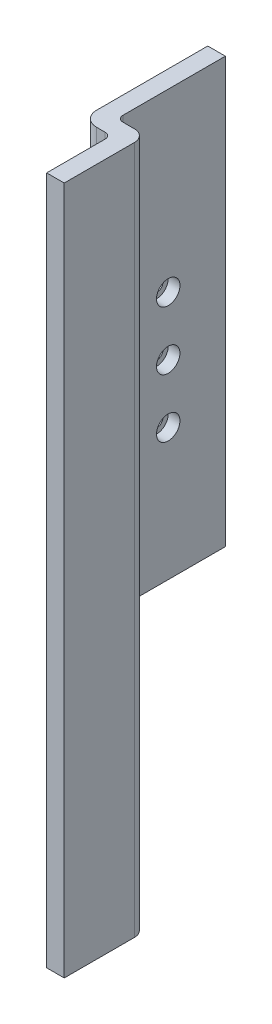
ISO-10303-21;
HEADER;
FILE_DESCRIPTION(('STEP AP214'),'2;1');
FILE_NAME('part.step','',(''),(''),'','','');
FILE_SCHEMA(('AUTOMOTIVE_DESIGN { 1 0 10303 214 1 1 1 1 }'));
ENDSEC;
DATA;
#1=APPLICATION_CONTEXT('core data for automotive mechanical design processes');
#2=APPLICATION_PROTOCOL_DEFINITION('international standard','automotive_design',2000,#1);
#3=PRODUCT_CONTEXT('',#1,'mechanical');
#4=PRODUCT('Part','Part','',(#3));
#5=PRODUCT_RELATED_PRODUCT_CATEGORY('part','',(#4));
#6=PRODUCT_DEFINITION_FORMATION('','',#4);
#7=PRODUCT_DEFINITION_CONTEXT('part definition',#1,'design');
#8=PRODUCT_DEFINITION('design','',#6,#7);
#9=PRODUCT_DEFINITION_SHAPE('','',#8);
#10=(LENGTH_UNIT() NAMED_UNIT(*) SI_UNIT(.MILLI.,.METRE.));
#11=(NAMED_UNIT(*) PLANE_ANGLE_UNIT() SI_UNIT($,.RADIAN.));
#12=(NAMED_UNIT(*) SI_UNIT($,.STERADIAN.) SOLID_ANGLE_UNIT());
#13=UNCERTAINTY_MEASURE_WITH_UNIT(LENGTH_MEASURE(1.E-05),#10,'distance_accuracy_value','');
#14=(GEOMETRIC_REPRESENTATION_CONTEXT(3) GLOBAL_UNCERTAINTY_ASSIGNED_CONTEXT((#13)) GLOBAL_UNIT_ASSIGNED_CONTEXT((#10,
#11,#12)) REPRESENTATION_CONTEXT('',''));
#15=CARTESIAN_POINT('',(0.,0.,0.));
#16=DIRECTION('',(0.,0.,1.));
#17=DIRECTION('',(1.,0.,0.));
#18=AXIS2_PLACEMENT_3D('',#15,#16,#17);
#19=CARTESIAN_POINT('',(16.,235.,-43.));
#20=DIRECTION('',(0.,0.,-1.));
#21=DIRECTION('',(-1.,0.,0.));
#22=AXIS2_PLACEMENT_3D('',#19,#20,#21);
#23=PLANE('',#22);
#24=DIRECTION('',(-1.,0.,0.));
#25=VECTOR('',#24,1.);
#26=CARTESIAN_POINT('',(16.,90.,-43.));
#27=LINE('',#26,#25);
#28=CARTESIAN_POINT('',(6.,90.,-43.));
#29=VERTEX_POINT('',#28);
#30=CARTESIAN_POINT('',(0.,90.,-43.));
#31=VERTEX_POINT('',#30);
#32=EDGE_CURVE('E241',#29,#31,#27,.T.);
#33=ORIENTED_EDGE('',*,*,#32,.T.);
#34=DIRECTION('',(0.,-1.,0.));
#35=VECTOR('',#34,1.);
#36=CARTESIAN_POINT('',(0.,235.,-43.));
#37=LINE('',#36,#35);
#38=CARTESIAN_POINT('',(0.,235.,-43.));
#39=VERTEX_POINT('',#38);
#40=EDGE_CURVE('E252',#39,#31,#37,.T.);
#41=ORIENTED_EDGE('',*,*,#40,.F.);
#42=DIRECTION('',(-1.,0.,0.));
#43=VECTOR('',#42,1.);
#44=CARTESIAN_POINT('',(16.,235.,-43.));
#45=LINE('',#44,#43);
#46=CARTESIAN_POINT('',(6.,235.,-43.));
#47=VERTEX_POINT('',#46);
#48=EDGE_CURVE('E168',#47,#39,#45,.T.);
#49=ORIENTED_EDGE('',*,*,#48,.F.);
#50=DIRECTION('',(0.,-1.,0.));
#51=VECTOR('',#50,1.);
#52=CARTESIAN_POINT('',(6.,235.,-43.));
#53=LINE('',#52,#51);
#54=EDGE_CURVE('E251',#47,#29,#53,.T.);
#55=ORIENTED_EDGE('',*,*,#54,.T.);
#56=EDGE_LOOP('',(#33,#41,#49,#55));
#57=FACE_BOUND('',#56,.T.);
#58=ADVANCED_FACE('F36',(#57),#23,.T.);
#59=CARTESIAN_POINT('',(16.,235.,22.));
#60=DIRECTION('',(0.,1.,0.));
#61=DIRECTION('',(0.,0.,1.));
#62=AXIS2_PLACEMENT_3D('',#59,#60,#61);
#63=PLANE('',#62);
#64=DIRECTION('',(0.,0.,-1.));
#65=VECTOR('',#64,1.);
#66=CARTESIAN_POINT('',(0.,235.,22.));
#67=LINE('',#66,#65);
#68=CARTESIAN_POINT('',(0.,235.,-5.));
#69=VERTEX_POINT('',#68);
#70=EDGE_CURVE('E263',#69,#39,#67,.T.);
#71=ORIENTED_EDGE('',*,*,#70,.F.);
#72=CARTESIAN_POINT('',(5.,235.,-5.));
#73=DIRECTION('',(0.,1.,0.));
#74=DIRECTION('',(0.,0.,1.));
#75=AXIS2_PLACEMENT_3D('',#72,#73,#74);
#76=CIRCLE('',#75,5.);
#77=CARTESIAN_POINT('',(5.,235.,0.));
#78=VERTEX_POINT('',#77);
#79=EDGE_CURVE('E216',#69,#78,#76,.T.);
#80=ORIENTED_EDGE('',*,*,#79,.T.);
#81=DIRECTION('',(1.,0.,0.));
#82=VECTOR('',#81,1.);
#83=CARTESIAN_POINT('',(0.,235.,0.));
#84=LINE('',#83,#82);
#85=CARTESIAN_POINT('',(8.,235.,0.));
#86=VERTEX_POINT('',#85);
#87=EDGE_CURVE('E153',#78,#86,#84,.T.);
#88=ORIENTED_EDGE('',*,*,#87,.T.);
#89=CARTESIAN_POINT('',(8.,235.,2.));
#90=DIRECTION('',(0.,1.,0.));
#91=DIRECTION('',(0.,0.,1.));
#92=AXIS2_PLACEMENT_3D('',#89,#90,#91);
#93=CIRCLE('',#92,2.);
#94=CARTESIAN_POINT('',(10.,235.,2.));
#95=VERTEX_POINT('',#94);
#96=EDGE_CURVE('E148',#86,#95,#93,.F.);
#97=ORIENTED_EDGE('',*,*,#96,.T.);
#98=DIRECTION('',(0.,0.,1.));
#99=VECTOR('',#98,1.);
#100=CARTESIAN_POINT('',(10.,235.,0.));
#101=LINE('',#100,#99);
#102=CARTESIAN_POINT('',(10.,235.,22.));
#103=VERTEX_POINT('',#102);
#104=EDGE_CURVE('E139',#95,#103,#101,.T.);
#105=ORIENTED_EDGE('',*,*,#104,.T.);
#106=DIRECTION('',(-1.,0.,0.));
#107=VECTOR('',#106,1.);
#108=CARTESIAN_POINT('',(16.,235.,22.));
#109=LINE('',#108,#107);
#110=CARTESIAN_POINT('',(16.,235.,22.));
#111=VERTEX_POINT('',#110);
#112=EDGE_CURVE('E145',#111,#103,#109,.T.);
#113=ORIENTED_EDGE('',*,*,#112,.F.);
#114=DIRECTION('',(0.,0.,-1.));
#115=VECTOR('',#114,1.);
#116=CARTESIAN_POINT('',(16.,235.,22.));
#117=LINE('',#116,#115);
#118=CARTESIAN_POINT('',(16.,235.,-2.));
#119=VERTEX_POINT('',#118);
#120=EDGE_CURVE('E174',#111,#119,#117,.T.);
#121=ORIENTED_EDGE('',*,*,#120,.T.);
#122=CARTESIAN_POINT('',(12.,235.,-2.));
#123=DIRECTION('',(0.,1.,0.));
#124=DIRECTION('',(0.,0.,1.));
#125=AXIS2_PLACEMENT_3D('',#122,#123,#124);
#126=CIRCLE('',#125,4.);
#127=CARTESIAN_POINT('',(12.,235.,-6.));
#128=VERTEX_POINT('',#127);
#129=EDGE_CURVE('E207',#119,#128,#126,.T.);
#130=ORIENTED_EDGE('',*,*,#129,.T.);
#131=DIRECTION('',(-1.,0.,0.));
#132=VECTOR('',#131,1.);
#133=CARTESIAN_POINT('',(16.,235.,-6.));
#134=LINE('',#133,#132);
#135=CARTESIAN_POINT('',(8.,235.,-6.));
#136=VERTEX_POINT('',#135);
#137=EDGE_CURVE('E257',#128,#136,#134,.T.);
#138=ORIENTED_EDGE('',*,*,#137,.T.);
#139=CARTESIAN_POINT('',(8.,235.,-8.));
#140=DIRECTION('',(0.,1.,0.));
#141=DIRECTION('',(0.,0.,1.));
#142=AXIS2_PLACEMENT_3D('',#139,#140,#141);
#143=CIRCLE('',#142,2.);
#144=CARTESIAN_POINT('',(6.,235.,-8.));
#145=VERTEX_POINT('',#144);
#146=EDGE_CURVE('E198',#136,#145,#143,.F.);
#147=ORIENTED_EDGE('',*,*,#146,.T.);
#148=DIRECTION('',(0.,0.,-1.));
#149=VECTOR('',#148,1.);
#150=CARTESIAN_POINT('',(6.,235.,-6.00000000000001));
#151=LINE('',#150,#149);
#152=EDGE_CURVE('E253',#145,#47,#151,.T.);
#153=ORIENTED_EDGE('',*,*,#152,.T.);
#154=ORIENTED_EDGE('',*,*,#48,.T.);
#155=EDGE_LOOP('',(#71,#80,#88,#97,#105,#113,#121,#130,#138,#147,#153,#154));
#156=FACE_BOUND('',#155,.T.);
#157=ADVANCED_FACE('F142',(#156),#63,.T.);
#158=CARTESIAN_POINT('',(16.,0.,22.));
#159=DIRECTION('',(0.,0.,1.));
#160=DIRECTION('',(1.,0.,0.));
#161=AXIS2_PLACEMENT_3D('',#158,#159,#160);
#162=PLANE('',#161);
#163=DIRECTION('',(0.,-1.,0.));
#164=VECTOR('',#163,1.);
#165=CARTESIAN_POINT('',(10.,235.,22.));
#166=LINE('',#165,#164);
#167=CARTESIAN_POINT('',(10.,0.,22.));
#168=VERTEX_POINT('',#167);
#169=EDGE_CURVE('E152',#103,#168,#166,.T.);
#170=ORIENTED_EDGE('',*,*,#169,.T.);
#171=DIRECTION('',(-1.,0.,0.));
#172=VECTOR('',#171,1.);
#173=CARTESIAN_POINT('',(16.,0.,22.));
#174=LINE('',#173,#172);
#175=CARTESIAN_POINT('',(16.,0.,22.));
#176=VERTEX_POINT('',#175);
#177=EDGE_CURVE('E169',#176,#168,#174,.T.);
#178=ORIENTED_EDGE('',*,*,#177,.F.);
#179=DIRECTION('',(0.,1.,0.));
#180=VECTOR('',#179,1.);
#181=CARTESIAN_POINT('',(16.,0.,22.));
#182=LINE('',#181,#180);
#183=EDGE_CURVE('E166',#176,#111,#182,.T.);
#184=ORIENTED_EDGE('',*,*,#183,.T.);
#185=ORIENTED_EDGE('',*,*,#112,.T.);
#186=EDGE_LOOP('',(#170,#178,#184,#185));
#187=FACE_BOUND('',#186,.T.);
#188=ADVANCED_FACE('F164',(#187),#162,.T.);
#189=CARTESIAN_POINT('',(16.,0.,-43.));
#190=DIRECTION('',(0.,-1.,0.));
#191=DIRECTION('',(0.,0.,-1.));
#192=AXIS2_PLACEMENT_3D('',#189,#190,#191);
#193=PLANE('',#192);
#194=DIRECTION('',(1.,0.,0.));
#195=VECTOR('',#194,1.);
#196=CARTESIAN_POINT('',(0.,0.,0.));
#197=LINE('',#196,#195);
#198=CARTESIAN_POINT('',(5.,0.,0.));
#199=VERTEX_POINT('',#198);
#200=CARTESIAN_POINT('',(8.,0.,0.));
#201=VERTEX_POINT('',#200);
#202=EDGE_CURVE('E285',#199,#201,#197,.T.);
#203=ORIENTED_EDGE('',*,*,#202,.F.);
#204=CARTESIAN_POINT('',(5.,0.,-5.));
#205=DIRECTION('',(0.,-1.,0.));
#206=DIRECTION('',(0.,0.,-1.));
#207=AXIS2_PLACEMENT_3D('',#204,#205,#206);
#208=CIRCLE('',#207,5.);
#209=CARTESIAN_POINT('',(0.,0.,-5.));
#210=VERTEX_POINT('',#209);
#211=EDGE_CURVE('E212',#199,#210,#208,.T.);
#212=ORIENTED_EDGE('',*,*,#211,.T.);
#213=DIRECTION('',(0.,0.,1.));
#214=VECTOR('',#213,1.);
#215=CARTESIAN_POINT('',(0.,0.,-43.));
#216=LINE('',#215,#214);
#217=CARTESIAN_POINT('',(0.,0.,-8.));
#218=VERTEX_POINT('',#217);
#219=EDGE_CURVE('E255',#218,#210,#216,.T.);
#220=ORIENTED_EDGE('',*,*,#219,.F.);
#221=DIRECTION('',(-1.,0.,0.));
#222=VECTOR('',#221,1.);
#223=CARTESIAN_POINT('',(16.,0.,-8.));
#224=LINE('',#223,#222);
#225=CARTESIAN_POINT('',(6.,0.,-8.));
#226=VERTEX_POINT('',#225);
#227=EDGE_CURVE('E248',#226,#218,#224,.T.);
#228=ORIENTED_EDGE('',*,*,#227,.F.);
#229=CARTESIAN_POINT('',(8.,0.,-8.));
#230=DIRECTION('',(0.,-1.,0.));
#231=DIRECTION('',(0.,0.,-1.));
#232=AXIS2_PLACEMENT_3D('',#229,#230,#231);
#233=CIRCLE('',#232,2.);
#234=CARTESIAN_POINT('',(8.,0.,-6.));
#235=VERTEX_POINT('',#234);
#236=EDGE_CURVE('E195',#226,#235,#233,.F.);
#237=ORIENTED_EDGE('',*,*,#236,.T.);
#238=DIRECTION('',(-1.,0.,0.));
#239=VECTOR('',#238,1.);
#240=CARTESIAN_POINT('',(16.,0.,-6.));
#241=LINE('',#240,#239);
#242=CARTESIAN_POINT('',(12.,0.,-6.));
#243=VERTEX_POINT('',#242);
#244=EDGE_CURVE('E247',#243,#235,#241,.T.);
#245=ORIENTED_EDGE('',*,*,#244,.F.);
#246=CARTESIAN_POINT('',(12.,0.,-2.));
#247=DIRECTION('',(0.,-1.,0.));
#248=DIRECTION('',(0.,0.,-1.));
#249=AXIS2_PLACEMENT_3D('',#246,#247,#248);
#250=CIRCLE('',#249,4.);
#251=CARTESIAN_POINT('',(16.,0.,-2.));
#252=VERTEX_POINT('',#251);
#253=EDGE_CURVE('E203',#243,#252,#250,.T.);
#254=ORIENTED_EDGE('',*,*,#253,.T.);
#255=DIRECTION('',(0.,0.,1.));
#256=VECTOR('',#255,1.);
#257=CARTESIAN_POINT('',(16.,0.,-43.));
#258=LINE('',#257,#256);
#259=EDGE_CURVE('E261',#252,#176,#258,.T.);
#260=ORIENTED_EDGE('',*,*,#259,.T.);
#261=ORIENTED_EDGE('',*,*,#177,.T.);
#262=DIRECTION('',(0.,0.,1.));
#263=VECTOR('',#262,1.);
#264=CARTESIAN_POINT('',(10.,0.,0.));
#265=LINE('',#264,#263);
#266=CARTESIAN_POINT('',(10.,0.,2.));
#267=VERTEX_POINT('',#266);
#268=EDGE_CURVE('E158',#267,#168,#265,.T.);
#269=ORIENTED_EDGE('',*,*,#268,.F.);
#270=CARTESIAN_POINT('',(8.,0.,2.));
#271=DIRECTION('',(0.,-1.,0.));
#272=DIRECTION('',(0.,0.,-1.));
#273=AXIS2_PLACEMENT_3D('',#270,#271,#272);
#274=CIRCLE('',#273,2.);
#275=EDGE_CURVE('E191',#267,#201,#274,.F.);
#276=ORIENTED_EDGE('',*,*,#275,.T.);
#277=EDGE_LOOP('',(#203,#212,#220,#228,#237,#245,#254,#260,#261,#269,#276));
#278=FACE_BOUND('',#277,.T.);
#279=ADVANCED_FACE('F277',(#278),#193,.T.);
#280=CARTESIAN_POINT('',(16.,0.,0.));
#281=DIRECTION('',(-1.,0.,0.));
#282=DIRECTION('',(0.,0.,1.));
#283=AXIS2_PLACEMENT_3D('',#280,#281,#282);
#284=PLANE('',#283);
#285=ORIENTED_EDGE('',*,*,#259,.F.);
#286=DIRECTION('',(0.,-1.,0.));
#287=VECTOR('',#286,1.);
#288=CARTESIAN_POINT('',(16.,0.,-2.));
#289=LINE('',#288,#287);
#290=EDGE_CURVE('E205',#252,#119,#289,.F.);
#291=ORIENTED_EDGE('',*,*,#290,.T.);
#292=ORIENTED_EDGE('',*,*,#120,.F.);
#293=ORIENTED_EDGE('',*,*,#183,.F.);
#294=EDGE_LOOP('',(#285,#291,#292,#293));
#295=FACE_BOUND('',#294,.T.);
#296=ADVANCED_FACE('F382',(#295),#284,.F.);
#297=CARTESIAN_POINT('',(0.,0.,0.));
#298=DIRECTION('',(-1.,0.,0.));
#299=DIRECTION('',(0.,0.,1.));
#300=AXIS2_PLACEMENT_3D('',#297,#298,#299);
#301=PLANE('',#300);
#302=CARTESIAN_POINT('',(0.,175.,-23.5));
#303=DIRECTION('',(1.,0.,0.));
#304=DIRECTION('',(0.,0.,-1.));
#305=AXIS2_PLACEMENT_3D('',#302,#303,#304);
#306=CIRCLE('',#305,2.25);
#307=CARTESIAN_POINT('',(0.,175.,-25.75));
#308=VERTEX_POINT('',#307);
#309=EDGE_CURVE('E312',#308,#308,#306,.T.);
#310=ORIENTED_EDGE('',*,*,#309,.T.);
#311=EDGE_LOOP('',(#310));
#312=FACE_BOUND('',#311,.T.);
#313=CARTESIAN_POINT('',(0.,155.,-23.5));
#314=DIRECTION('',(1.,0.,0.));
#315=DIRECTION('',(0.,0.,-1.));
#316=AXIS2_PLACEMENT_3D('',#313,#314,#315);
#317=CIRCLE('',#316,2.25);
#318=CARTESIAN_POINT('',(0.,155.,-25.75));
#319=VERTEX_POINT('',#318);
#320=EDGE_CURVE('E300',#319,#319,#317,.T.);
#321=ORIENTED_EDGE('',*,*,#320,.T.);
#322=EDGE_LOOP('',(#321));
#323=FACE_BOUND('',#322,.T.);
#324=CARTESIAN_POINT('',(0.,135.,-23.5));
#325=DIRECTION('',(1.,0.,0.));
#326=DIRECTION('',(0.,0.,-1.));
#327=AXIS2_PLACEMENT_3D('',#324,#325,#326);
#328=CIRCLE('',#327,2.25);
#329=CARTESIAN_POINT('',(0.,135.,-25.75));
#330=VERTEX_POINT('',#329);
#331=EDGE_CURVE('E286',#330,#330,#328,.T.);
#332=ORIENTED_EDGE('',*,*,#331,.T.);
#333=EDGE_LOOP('',(#332));
#334=FACE_BOUND('',#333,.T.);
#335=ORIENTED_EDGE('',*,*,#219,.T.);
#336=DIRECTION('',(0.,-1.,0.));
#337=VECTOR('',#336,1.);
#338=CARTESIAN_POINT('',(0.,235.,-5.));
#339=LINE('',#338,#337);
#340=EDGE_CURVE('E214',#210,#69,#339,.F.);
#341=ORIENTED_EDGE('',*,*,#340,.T.);
#342=ORIENTED_EDGE('',*,*,#70,.T.);
#343=ORIENTED_EDGE('',*,*,#40,.T.);
#344=DIRECTION('',(0.,0.,-1.));
#345=VECTOR('',#344,1.);
#346=CARTESIAN_POINT('',(0.,90.,-8.));
#347=LINE('',#346,#345);
#348=CARTESIAN_POINT('',(0.,90.,-14.));
#349=VERTEX_POINT('',#348);
#350=EDGE_CURVE('E243',#349,#31,#347,.T.);
#351=ORIENTED_EDGE('',*,*,#350,.F.);
#352=CARTESIAN_POINT('',(0.,84.,-14.));
#353=DIRECTION('',(-1.,0.,0.));
#354=DIRECTION('',(0.,0.,1.));
#355=AXIS2_PLACEMENT_3D('',#352,#353,#354);
#356=CIRCLE('',#355,6.);
#357=CARTESIAN_POINT('',(0.,84.,-8.));
#358=VERTEX_POINT('',#357);
#359=EDGE_CURVE('E44',#349,#358,#356,.F.);
#360=ORIENTED_EDGE('',*,*,#359,.T.);
#361=DIRECTION('',(0.,1.,0.));
#362=VECTOR('',#361,1.);
#363=CARTESIAN_POINT('',(0.,0.,-8.));
#364=LINE('',#363,#362);
#365=EDGE_CURVE('E162',#218,#358,#364,.T.);
#366=ORIENTED_EDGE('',*,*,#365,.F.);
#367=EDGE_LOOP('',(#335,#341,#342,#343,#351,#360,#366));
#368=FACE_BOUND('',#367,.T.);
#369=ADVANCED_FACE('F267',(#312,#323,#334,#368),#301,.T.);
#370=CARTESIAN_POINT('',(6.,235.,-6.00000000000001));
#371=DIRECTION('',(-1.,0.,0.));
#372=DIRECTION('',(0.,0.,1.));
#373=AXIS2_PLACEMENT_3D('',#370,#371,#372);
#374=PLANE('',#373);
#375=CARTESIAN_POINT('',(6.,175.,-23.5));
#376=DIRECTION('',(1.,0.,0.));
#377=DIRECTION('',(0.,0.,-1.));
#378=AXIS2_PLACEMENT_3D('',#375,#376,#377);
#379=CIRCLE('',#378,4.);
#380=CARTESIAN_POINT('',(6.,175.,-27.5));
#381=VERTEX_POINT('',#380);
#382=EDGE_CURVE('E321',#381,#381,#379,.T.);
#383=ORIENTED_EDGE('',*,*,#382,.F.);
#384=EDGE_LOOP('',(#383));
#385=FACE_BOUND('',#384,.T.);
#386=CARTESIAN_POINT('',(6.,155.,-23.5));
#387=DIRECTION('',(1.,0.,0.));
#388=DIRECTION('',(0.,0.,-1.));
#389=AXIS2_PLACEMENT_3D('',#386,#387,#388);
#390=CIRCLE('',#389,4.);
#391=CARTESIAN_POINT('',(6.,155.,-27.5));
#392=VERTEX_POINT('',#391);
#393=EDGE_CURVE('E309',#392,#392,#390,.T.);
#394=ORIENTED_EDGE('',*,*,#393,.F.);
#395=EDGE_LOOP('',(#394));
#396=FACE_BOUND('',#395,.T.);
#397=CARTESIAN_POINT('',(6.,135.,-23.5));
#398=DIRECTION('',(1.,0.,0.));
#399=DIRECTION('',(0.,0.,-1.));
#400=AXIS2_PLACEMENT_3D('',#397,#398,#399);
#401=CIRCLE('',#400,4.);
#402=CARTESIAN_POINT('',(6.,135.,-27.5));
#403=VERTEX_POINT('',#402);
#404=EDGE_CURVE('E297',#403,#403,#401,.T.);
#405=ORIENTED_EDGE('',*,*,#404,.F.);
#406=EDGE_LOOP('',(#405));
#407=FACE_BOUND('',#406,.T.);
#408=ORIENTED_EDGE('',*,*,#152,.F.);
#409=DIRECTION('',(0.,-1.,0.));
#410=VECTOR('',#409,1.);
#411=CARTESIAN_POINT('',(6.,0.,-8.));
#412=LINE('',#411,#410);
#413=CARTESIAN_POINT('',(6.,84.,-8.));
#414=VERTEX_POINT('',#413);
#415=EDGE_CURVE('E50',#145,#414,#412,.T.);
#416=ORIENTED_EDGE('',*,*,#415,.T.);
#417=CARTESIAN_POINT('',(6.,84.,-14.));
#418=DIRECTION('',(-1.,0.,0.));
#419=DIRECTION('',(0.,0.,1.));
#420=AXIS2_PLACEMENT_3D('',#417,#418,#419);
#421=CIRCLE('',#420,6.);
#422=CARTESIAN_POINT('',(6.,90.,-14.));
#423=VERTEX_POINT('',#422);
#424=EDGE_CURVE('E11',#414,#423,#421,.T.);
#425=ORIENTED_EDGE('',*,*,#424,.T.);
#426=DIRECTION('',(0.,0.,-1.));
#427=VECTOR('',#426,1.);
#428=CARTESIAN_POINT('',(6.,90.,-6.00000000000001));
#429=LINE('',#428,#427);
#430=EDGE_CURVE('E180',#423,#29,#429,.T.);
#431=ORIENTED_EDGE('',*,*,#430,.T.);
#432=ORIENTED_EDGE('',*,*,#54,.F.);
#433=EDGE_LOOP('',(#408,#416,#425,#431,#432));
#434=FACE_BOUND('',#433,.T.);
#435=ADVANCED_FACE('F235',(#385,#396,#407,#434),#374,.F.);
#436=CARTESIAN_POINT('',(16.,235.,-6.));
#437=DIRECTION('',(0.,0.,1.));
#438=DIRECTION('',(1.,0.,0.));
#439=AXIS2_PLACEMENT_3D('',#436,#437,#438);
#440=PLANE('',#439);
#441=ORIENTED_EDGE('',*,*,#137,.F.);
#442=DIRECTION('',(0.,-1.,0.));
#443=VECTOR('',#442,1.);
#444=CARTESIAN_POINT('',(12.,235.,-6.));
#445=LINE('',#444,#443);
#446=EDGE_CURVE('E200',#128,#243,#445,.T.);
#447=ORIENTED_EDGE('',*,*,#446,.T.);
#448=ORIENTED_EDGE('',*,*,#244,.T.);
#449=DIRECTION('',(0.,-1.,0.));
#450=VECTOR('',#449,1.);
#451=CARTESIAN_POINT('',(8.,235.,-6.));
#452=LINE('',#451,#450);
#453=EDGE_CURVE('E188',#235,#136,#452,.F.);
#454=ORIENTED_EDGE('',*,*,#453,.T.);
#455=EDGE_LOOP('',(#441,#447,#448,#454));
#456=FACE_BOUND('',#455,.T.);
#457=ADVANCED_FACE('F272',(#456),#440,.F.);
#458=CARTESIAN_POINT('',(16.,90.,-8.));
#459=DIRECTION('',(0.,1.,0.));
#460=DIRECTION('',(-1.,0.,0.));
#461=AXIS2_PLACEMENT_3D('',#458,#459,#460);
#462=PLANE('',#461);
#463=ORIENTED_EDGE('',*,*,#430,.F.);
#464=DIRECTION('',(-1.,0.,0.));
#465=VECTOR('',#464,1.);
#466=CARTESIAN_POINT('',(0.,90.,-14.));
#467=LINE('',#466,#465);
#468=EDGE_CURVE('E218',#423,#349,#467,.T.);
#469=ORIENTED_EDGE('',*,*,#468,.T.);
#470=ORIENTED_EDGE('',*,*,#350,.T.);
#471=ORIENTED_EDGE('',*,*,#32,.F.);
#472=EDGE_LOOP('',(#463,#469,#470,#471));
#473=FACE_BOUND('',#472,.T.);
#474=ADVANCED_FACE('F239',(#473),#462,.F.);
#475=CARTESIAN_POINT('',(16.,0.,-8.));
#476=DIRECTION('',(0.,0.,1.));
#477=DIRECTION('',(1.,0.,0.));
#478=AXIS2_PLACEMENT_3D('',#475,#476,#477);
#479=PLANE('',#478);
#480=ORIENTED_EDGE('',*,*,#365,.T.);
#481=DIRECTION('',(-1.,0.,0.));
#482=VECTOR('',#481,1.);
#483=CARTESIAN_POINT('',(6.,84.,-8.));
#484=LINE('',#483,#482);
#485=EDGE_CURVE('E221',#358,#414,#484,.F.);
#486=ORIENTED_EDGE('',*,*,#485,.T.);
#487=DIRECTION('',(0.,1.,0.));
#488=VECTOR('',#487,1.);
#489=CARTESIAN_POINT('',(6.,235.,-8.));
#490=LINE('',#489,#488);
#491=EDGE_CURVE('E172',#226,#414,#490,.T.);
#492=ORIENTED_EDGE('',*,*,#491,.F.);
#493=ORIENTED_EDGE('',*,*,#227,.T.);
#494=EDGE_LOOP('',(#480,#486,#492,#493));
#495=FACE_BOUND('',#494,.T.);
#496=ADVANCED_FACE('F224',(#495),#479,.F.);
#497=CARTESIAN_POINT('',(10.,235.,0.));
#498=DIRECTION('',(1.,0.,0.));
#499=DIRECTION('',(0.,0.,-1.));
#500=AXIS2_PLACEMENT_3D('',#497,#498,#499);
#501=PLANE('',#500);
#502=ORIENTED_EDGE('',*,*,#104,.F.);
#503=DIRECTION('',(0.,-1.,0.));
#504=VECTOR('',#503,1.);
#505=CARTESIAN_POINT('',(10.,0.,2.));
#506=LINE('',#505,#504);
#507=EDGE_CURVE('E182',#95,#267,#506,.T.);
#508=ORIENTED_EDGE('',*,*,#507,.T.);
#509=ORIENTED_EDGE('',*,*,#268,.T.);
#510=ORIENTED_EDGE('',*,*,#169,.F.);
#511=EDGE_LOOP('',(#502,#508,#509,#510));
#512=FACE_BOUND('',#511,.T.);
#513=ADVANCED_FACE('F156',(#512),#501,.F.);
#514=CARTESIAN_POINT('',(0.,235.,0.));
#515=DIRECTION('',(0.,0.,-1.));
#516=DIRECTION('',(-1.,0.,0.));
#517=AXIS2_PLACEMENT_3D('',#514,#515,#516);
#518=PLANE('',#517);
#519=ORIENTED_EDGE('',*,*,#87,.F.);
#520=DIRECTION('',(0.,-1.,0.));
#521=VECTOR('',#520,1.);
#522=CARTESIAN_POINT('',(5.,0.,0.));
#523=LINE('',#522,#521);
#524=EDGE_CURVE('E209',#78,#199,#523,.T.);
#525=ORIENTED_EDGE('',*,*,#524,.T.);
#526=ORIENTED_EDGE('',*,*,#202,.T.);
#527=DIRECTION('',(0.,-1.,0.));
#528=VECTOR('',#527,1.);
#529=CARTESIAN_POINT('',(8.,235.,0.));
#530=LINE('',#529,#528);
#531=EDGE_CURVE('E184',#201,#86,#530,.F.);
#532=ORIENTED_EDGE('',*,*,#531,.T.);
#533=EDGE_LOOP('',(#519,#525,#526,#532));
#534=FACE_BOUND('',#533,.T.);
#535=ADVANCED_FACE('F378',(#534),#518,.F.);
#536=CARTESIAN_POINT('',(6.,135.,-23.5));
#537=DIRECTION('',(1.,0.,0.));
#538=DIRECTION('',(0.,0.,-1.));
#539=AXIS2_PLACEMENT_3D('',#536,#537,#538);
#540=CYLINDRICAL_SURFACE('',#539,2.25);
#541=ORIENTED_EDGE('',*,*,#331,.F.);
#542=EDGE_LOOP('',(#541));
#543=FACE_BOUND('',#542,.T.);
#544=CARTESIAN_POINT('',(2.,135.,-23.5));
#545=DIRECTION('',(1.,0.,0.));
#546=DIRECTION('',(0.,0.,-1.));
#547=AXIS2_PLACEMENT_3D('',#544,#545,#546);
#548=CIRCLE('',#547,2.25);
#549=CARTESIAN_POINT('',(2.,135.,-25.75));
#550=VERTEX_POINT('',#549);
#551=EDGE_CURVE('E291',#550,#550,#548,.T.);
#552=ORIENTED_EDGE('',*,*,#551,.T.);
#553=EDGE_LOOP('',(#552));
#554=FACE_BOUND('',#553,.T.);
#555=ADVANCED_FACE('F347',(#543,#554),#540,.F.);
#556=CARTESIAN_POINT('',(2.,137.25,-23.5));
#557=DIRECTION('',(-1.,0.,0.));
#558=DIRECTION('',(0.,0.,1.));
#559=AXIS2_PLACEMENT_3D('',#556,#557,#558);
#560=PLANE('',#559);
#561=ORIENTED_EDGE('',*,*,#551,.F.);
#562=EDGE_LOOP('',(#561));
#563=FACE_BOUND('',#562,.T.);
#564=CARTESIAN_POINT('',(2.,135.,-23.5));
#565=DIRECTION('',(1.,0.,0.));
#566=DIRECTION('',(0.,0.,-1.));
#567=AXIS2_PLACEMENT_3D('',#564,#565,#566);
#568=CIRCLE('',#567,4.);
#569=CARTESIAN_POINT('',(2.,135.,-27.5));
#570=VERTEX_POINT('',#569);
#571=EDGE_CURVE('E294',#570,#570,#568,.T.);
#572=ORIENTED_EDGE('',*,*,#571,.T.);
#573=EDGE_LOOP('',(#572));
#574=FACE_BOUND('',#573,.T.);
#575=ADVANCED_FACE('F337',(#563,#574),#560,.F.);
#576=CARTESIAN_POINT('',(6.,135.,-23.5));
#577=DIRECTION('',(1.,0.,0.));
#578=DIRECTION('',(0.,0.,-1.));
#579=AXIS2_PLACEMENT_3D('',#576,#577,#578);
#580=CYLINDRICAL_SURFACE('',#579,4.);
#581=ORIENTED_EDGE('',*,*,#571,.F.);
#582=EDGE_LOOP('',(#581));
#583=FACE_BOUND('',#582,.T.);
#584=ORIENTED_EDGE('',*,*,#404,.T.);
#585=EDGE_LOOP('',(#584));
#586=FACE_BOUND('',#585,.T.);
#587=ADVANCED_FACE('F334',(#583,#586),#580,.F.);
#588=CARTESIAN_POINT('',(6.,155.,-23.5));
#589=DIRECTION('',(1.,0.,0.));
#590=DIRECTION('',(0.,0.,-1.));
#591=AXIS2_PLACEMENT_3D('',#588,#589,#590);
#592=CYLINDRICAL_SURFACE('',#591,2.25);
#593=ORIENTED_EDGE('',*,*,#320,.F.);
#594=EDGE_LOOP('',(#593));
#595=FACE_BOUND('',#594,.T.);
#596=CARTESIAN_POINT('',(2.,155.,-23.5));
#597=DIRECTION('',(1.,0.,0.));
#598=DIRECTION('',(0.,0.,-1.));
#599=AXIS2_PLACEMENT_3D('',#596,#597,#598);
#600=CIRCLE('',#599,2.25);
#601=CARTESIAN_POINT('',(2.,155.,-25.75));
#602=VERTEX_POINT('',#601);
#603=EDGE_CURVE('E303',#602,#602,#600,.T.);
#604=ORIENTED_EDGE('',*,*,#603,.T.);
#605=EDGE_LOOP('',(#604));
#606=FACE_BOUND('',#605,.T.);
#607=ADVANCED_FACE('F336',(#595,#606),#592,.F.);
#608=CARTESIAN_POINT('',(2.,157.25,-23.5));
#609=DIRECTION('',(-1.,0.,0.));
#610=DIRECTION('',(0.,0.,1.));
#611=AXIS2_PLACEMENT_3D('',#608,#609,#610);
#612=PLANE('',#611);
#613=ORIENTED_EDGE('',*,*,#603,.F.);
#614=EDGE_LOOP('',(#613));
#615=FACE_BOUND('',#614,.T.);
#616=CARTESIAN_POINT('',(2.,155.,-23.5));
#617=DIRECTION('',(1.,0.,0.));
#618=DIRECTION('',(0.,0.,-1.));
#619=AXIS2_PLACEMENT_3D('',#616,#617,#618);
#620=CIRCLE('',#619,4.);
#621=CARTESIAN_POINT('',(2.,155.,-27.5));
#622=VERTEX_POINT('',#621);
#623=EDGE_CURVE('E306',#622,#622,#620,.T.);
#624=ORIENTED_EDGE('',*,*,#623,.T.);
#625=EDGE_LOOP('',(#624));
#626=FACE_BOUND('',#625,.T.);
#627=ADVANCED_FACE('F344',(#615,#626),#612,.F.);
#628=CARTESIAN_POINT('',(6.,155.,-23.5));
#629=DIRECTION('',(1.,0.,0.));
#630=DIRECTION('',(0.,0.,-1.));
#631=AXIS2_PLACEMENT_3D('',#628,#629,#630);
#632=CYLINDRICAL_SURFACE('',#631,4.);
#633=ORIENTED_EDGE('',*,*,#623,.F.);
#634=EDGE_LOOP('',(#633));
#635=FACE_BOUND('',#634,.T.);
#636=ORIENTED_EDGE('',*,*,#393,.T.);
#637=EDGE_LOOP('',(#636));
#638=FACE_BOUND('',#637,.T.);
#639=ADVANCED_FACE('F518',(#635,#638),#632,.F.);
#640=CARTESIAN_POINT('',(6.,175.,-23.5));
#641=DIRECTION('',(1.,0.,0.));
#642=DIRECTION('',(0.,0.,-1.));
#643=AXIS2_PLACEMENT_3D('',#640,#641,#642);
#644=CYLINDRICAL_SURFACE('',#643,2.25);
#645=ORIENTED_EDGE('',*,*,#309,.F.);
#646=EDGE_LOOP('',(#645));
#647=FACE_BOUND('',#646,.T.);
#648=CARTESIAN_POINT('',(2.,175.,-23.5));
#649=DIRECTION('',(1.,0.,0.));
#650=DIRECTION('',(0.,0.,-1.));
#651=AXIS2_PLACEMENT_3D('',#648,#649,#650);
#652=CIRCLE('',#651,2.25);
#653=CARTESIAN_POINT('',(2.,175.,-25.75));
#654=VERTEX_POINT('',#653);
#655=EDGE_CURVE('E315',#654,#654,#652,.T.);
#656=ORIENTED_EDGE('',*,*,#655,.T.);
#657=EDGE_LOOP('',(#656));
#658=FACE_BOUND('',#657,.T.);
#659=ADVANCED_FACE('F508',(#647,#658),#644,.F.);
#660=CARTESIAN_POINT('',(2.,177.25,-23.5));
#661=DIRECTION('',(-1.,0.,0.));
#662=DIRECTION('',(0.,0.,1.));
#663=AXIS2_PLACEMENT_3D('',#660,#661,#662);
#664=PLANE('',#663);
#665=ORIENTED_EDGE('',*,*,#655,.F.);
#666=EDGE_LOOP('',(#665));
#667=FACE_BOUND('',#666,.T.);
#668=CARTESIAN_POINT('',(2.,175.,-23.5));
#669=DIRECTION('',(1.,0.,0.));
#670=DIRECTION('',(0.,0.,-1.));
#671=AXIS2_PLACEMENT_3D('',#668,#669,#670);
#672=CIRCLE('',#671,4.);
#673=CARTESIAN_POINT('',(2.,175.,-27.5));
#674=VERTEX_POINT('',#673);
#675=EDGE_CURVE('E318',#674,#674,#672,.T.);
#676=ORIENTED_EDGE('',*,*,#675,.T.);
#677=EDGE_LOOP('',(#676));
#678=FACE_BOUND('',#677,.T.);
#679=ADVANCED_FACE('F498',(#667,#678),#664,.F.);
#680=CARTESIAN_POINT('',(6.,175.,-23.5));
#681=DIRECTION('',(1.,0.,0.));
#682=DIRECTION('',(0.,0.,-1.));
#683=AXIS2_PLACEMENT_3D('',#680,#681,#682);
#684=CYLINDRICAL_SURFACE('',#683,4.);
#685=ORIENTED_EDGE('',*,*,#675,.F.);
#686=EDGE_LOOP('',(#685));
#687=FACE_BOUND('',#686,.T.);
#688=ORIENTED_EDGE('',*,*,#382,.T.);
#689=EDGE_LOOP('',(#688));
#690=FACE_BOUND('',#689,.T.);
#691=ADVANCED_FACE('F325',(#687,#690),#684,.F.);
#692=CARTESIAN_POINT('',(8.,235.,2.));
#693=DIRECTION('',(0.,1.,0.));
#694=DIRECTION('',(0.,0.,1.));
#695=AXIS2_PLACEMENT_3D('',#692,#693,#694);
#696=CYLINDRICAL_SURFACE('',#695,2.);
#697=ORIENTED_EDGE('',*,*,#96,.F.);
#698=ORIENTED_EDGE('',*,*,#531,.F.);
#699=ORIENTED_EDGE('',*,*,#275,.F.);
#700=ORIENTED_EDGE('',*,*,#507,.F.);
#701=EDGE_LOOP('',(#697,#698,#699,#700));
#702=FACE_BOUND('',#701,.T.);
#703=ADVANCED_FACE('F360',(#702),#696,.F.);
#704=CARTESIAN_POINT('',(8.,235.,-8.));
#705=DIRECTION('',(0.,1.,0.));
#706=DIRECTION('',(0.,0.,1.));
#707=AXIS2_PLACEMENT_3D('',#704,#705,#706);
#708=CYLINDRICAL_SURFACE('',#707,2.);
#709=ORIENTED_EDGE('',*,*,#146,.F.);
#710=ORIENTED_EDGE('',*,*,#453,.F.);
#711=ORIENTED_EDGE('',*,*,#236,.F.);
#712=ORIENTED_EDGE('',*,*,#491,.T.);
#713=ORIENTED_EDGE('',*,*,#415,.F.);
#714=EDGE_LOOP('',(#709,#710,#711,#712,#713));
#715=FACE_BOUND('',#714,.T.);
#716=ADVANCED_FACE('F231',(#715),#708,.F.);
#717=CARTESIAN_POINT('',(12.,235.,-2.));
#718=DIRECTION('',(0.,-1.,0.));
#719=DIRECTION('',(0.,0.,-1.));
#720=AXIS2_PLACEMENT_3D('',#717,#718,#719);
#721=CYLINDRICAL_SURFACE('',#720,4.);
#722=ORIENTED_EDGE('',*,*,#129,.F.);
#723=ORIENTED_EDGE('',*,*,#290,.F.);
#724=ORIENTED_EDGE('',*,*,#253,.F.);
#725=ORIENTED_EDGE('',*,*,#446,.F.);
#726=EDGE_LOOP('',(#722,#723,#724,#725));
#727=FACE_BOUND('',#726,.T.);
#728=ADVANCED_FACE('F366',(#727),#721,.T.);
#729=CARTESIAN_POINT('',(5.,235.,-5.));
#730=DIRECTION('',(0.,1.,0.));
#731=DIRECTION('',(0.,0.,1.));
#732=AXIS2_PLACEMENT_3D('',#729,#730,#731);
#733=CYLINDRICAL_SURFACE('',#732,5.);
#734=ORIENTED_EDGE('',*,*,#79,.F.);
#735=ORIENTED_EDGE('',*,*,#340,.F.);
#736=ORIENTED_EDGE('',*,*,#211,.F.);
#737=ORIENTED_EDGE('',*,*,#524,.F.);
#738=EDGE_LOOP('',(#734,#735,#736,#737));
#739=FACE_BOUND('',#738,.T.);
#740=ADVANCED_FACE('F368',(#739),#733,.T.);
#741=CARTESIAN_POINT('',(16.,84.,-14.));
#742=DIRECTION('',(1.,0.,0.));
#743=DIRECTION('',(0.,0.,-1.));
#744=AXIS2_PLACEMENT_3D('',#741,#742,#743);
#745=CYLINDRICAL_SURFACE('',#744,6.);
#746=ORIENTED_EDGE('',*,*,#424,.F.);
#747=ORIENTED_EDGE('',*,*,#485,.F.);
#748=ORIENTED_EDGE('',*,*,#359,.F.);
#749=ORIENTED_EDGE('',*,*,#468,.F.);
#750=EDGE_LOOP('',(#746,#747,#748,#749));
#751=FACE_BOUND('',#750,.T.);
#752=ADVANCED_FACE('F38',(#751),#745,.F.);
#753=CLOSED_SHELL('',(#58,#157,#188,#279,#296,#369,#435,#457,#474,#496,#513,#535,#555,#575,#587,
#607,#627,#639,#659,#679,#691,#703,#716,#728,#740,#752));
#754=MANIFOLD_SOLID_BREP('B2',#753);
#755=ADVANCED_BREP_SHAPE_REPRESENTATION('',(#18,#754),#14);
#756=SHAPE_DEFINITION_REPRESENTATION(#9,#755);
ENDSEC;
END-ISO-10303-21;
